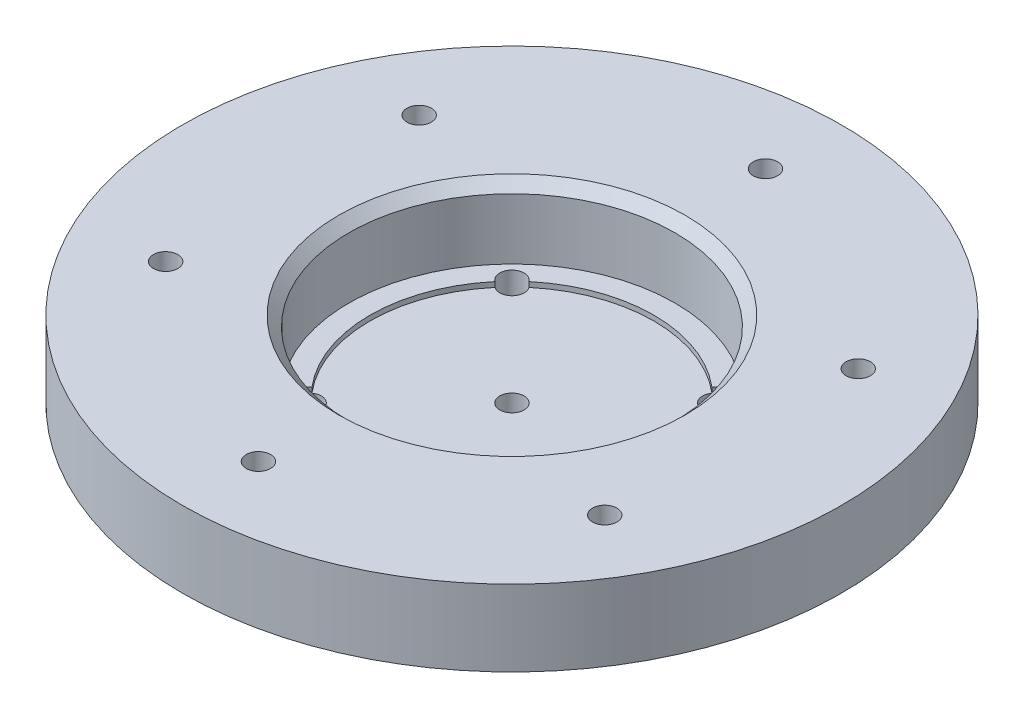
ISO-10303-21;
HEADER;
FILE_DESCRIPTION(('STEP AP214'),'2;1');
FILE_NAME('part.step','',(''),(''),'','','');
FILE_SCHEMA(('AUTOMOTIVE_DESIGN { 1 0 10303 214 1 1 1 1 }'));
ENDSEC;
DATA;
#1=APPLICATION_CONTEXT('core data for automotive mechanical design processes');
#2=APPLICATION_PROTOCOL_DEFINITION('international standard','automotive_design',2000,#1);
#3=PRODUCT_CONTEXT('',#1,'mechanical');
#4=PRODUCT('Part','Part','',(#3));
#5=PRODUCT_RELATED_PRODUCT_CATEGORY('part','',(#4));
#6=PRODUCT_DEFINITION_FORMATION('','',#4);
#7=PRODUCT_DEFINITION_CONTEXT('part definition',#1,'design');
#8=PRODUCT_DEFINITION('design','',#6,#7);
#9=PRODUCT_DEFINITION_SHAPE('','',#8);
#10=(LENGTH_UNIT() NAMED_UNIT(*) SI_UNIT(.MILLI.,.METRE.));
#11=(NAMED_UNIT(*) PLANE_ANGLE_UNIT() SI_UNIT($,.RADIAN.));
#12=(NAMED_UNIT(*) SI_UNIT($,.STERADIAN.) SOLID_ANGLE_UNIT());
#13=UNCERTAINTY_MEASURE_WITH_UNIT(LENGTH_MEASURE(1.E-05),#10,'distance_accuracy_value','');
#14=(GEOMETRIC_REPRESENTATION_CONTEXT(3) GLOBAL_UNCERTAINTY_ASSIGNED_CONTEXT((#13)) GLOBAL_UNIT_ASSIGNED_CONTEXT((#10,
#11,#12)) REPRESENTATION_CONTEXT('',''));
#15=CARTESIAN_POINT('',(0.,0.,0.));
#16=DIRECTION('',(0.,0.,1.));
#17=DIRECTION('',(1.,0.,0.));
#18=AXIS2_PLACEMENT_3D('',#15,#16,#17);
#19=CARTESIAN_POINT('',(0.,0.,0.));
#20=DIRECTION('',(0.,1.,0.));
#21=DIRECTION('',(0.,0.,1.));
#22=AXIS2_PLACEMENT_3D('',#19,#20,#21);
#23=CYLINDRICAL_SURFACE('',#22,14.);
#24=CARTESIAN_POINT('',(0.,7.5,0.));
#25=DIRECTION('',(0.,1.,0.));
#26=DIRECTION('',(0.,0.,1.));
#27=AXIS2_PLACEMENT_3D('',#24,#25,#26);
#28=CIRCLE('',#27,14.);
#29=CARTESIAN_POINT('',(-10.7015583561758,7.5,-9.02644164382415));
#30=VERTEX_POINT('',#29);
#31=CARTESIAN_POINT('',(-10.7015583561759,7.5,9.02644164382415));
#32=VERTEX_POINT('',#31);
#33=EDGE_CURVE('E123',#30,#32,#28,.T.);
#34=ORIENTED_EDGE('',*,*,#33,.F.);
#35=DIRECTION('',(0.,-1.,0.));
#36=VECTOR('',#35,1.);
#37=CARTESIAN_POINT('',(-10.7015583561758,7.5,-9.02644164382415));
#38=LINE('',#37,#36);
#39=CARTESIAN_POINT('',(-10.7015583561758,8.,-9.02644164382416));
#40=VERTEX_POINT('',#39);
#41=EDGE_CURVE('E109',#30,#40,#38,.F.);
#42=ORIENTED_EDGE('',*,*,#41,.T.);
#43=CARTESIAN_POINT('',(0.,8.,0.));
#44=DIRECTION('',(0.,1.,0.));
#45=DIRECTION('',(0.,0.,1.));
#46=AXIS2_PLACEMENT_3D('',#43,#44,#45);
#47=CIRCLE('',#46,14.);
#48=CARTESIAN_POINT('',(-10.7015583561759,8.,9.02644164382415));
#49=VERTEX_POINT('',#48);
#50=EDGE_CURVE('E121',#40,#49,#47,.T.);
#51=ORIENTED_EDGE('',*,*,#50,.T.);
#52=DIRECTION('',(0.,-1.,0.));
#53=VECTOR('',#52,1.);
#54=CARTESIAN_POINT('',(-10.7015583561758,7.5,9.02644164382415));
#55=LINE('',#54,#53);
#56=EDGE_CURVE('E157',#49,#32,#55,.T.);
#57=ORIENTED_EDGE('',*,*,#56,.T.);
#58=EDGE_LOOP('',(#34,#42,#51,#57));
#59=FACE_BOUND('',#58,.T.);
#60=ADVANCED_FACE('F43',(#59),#23,.F.);
#61=CARTESIAN_POINT('',(10.7015583561758,7.5,9.02644164382416));
#62=VERTEX_POINT('',#61);
#63=CARTESIAN_POINT('',(10.7015583561758,7.5,-9.02644164382415));
#64=VERTEX_POINT('',#63);
#65=EDGE_CURVE('E137',#62,#64,#28,.T.);
#66=ORIENTED_EDGE('',*,*,#65,.F.);
#67=DIRECTION('',(0.,-1.,0.));
#68=VECTOR('',#67,1.);
#69=CARTESIAN_POINT('',(10.7015583561758,7.5,9.02644164382415));
#70=LINE('',#69,#68);
#71=CARTESIAN_POINT('',(10.7015583561758,8.,9.02644164382416));
#72=VERTEX_POINT('',#71);
#73=EDGE_CURVE('E116',#62,#72,#70,.F.);
#74=ORIENTED_EDGE('',*,*,#73,.T.);
#75=CARTESIAN_POINT('',(10.7015583561758,8.,-9.02644164382415));
#76=VERTEX_POINT('',#75);
#77=EDGE_CURVE('E134',#72,#76,#47,.T.);
#78=ORIENTED_EDGE('',*,*,#77,.T.);
#79=DIRECTION('',(0.,-1.,0.));
#80=VECTOR('',#79,1.);
#81=CARTESIAN_POINT('',(10.7015583561758,7.5,-9.02644164382415));
#82=LINE('',#81,#80);
#83=EDGE_CURVE('E170',#76,#64,#82,.T.);
#84=ORIENTED_EDGE('',*,*,#83,.T.);
#85=EDGE_LOOP('',(#66,#74,#78,#84));
#86=FACE_BOUND('',#85,.T.);
#87=ADVANCED_FACE('F206',(#86),#23,.F.);
#88=CARTESIAN_POINT('',(9.02644164382416,8.,-10.7015583561758));
#89=VERTEX_POINT('',#88);
#90=CARTESIAN_POINT('',(-9.02644164382416,8.,-10.7015583561758));
#91=VERTEX_POINT('',#90);
#92=EDGE_CURVE('E131',#89,#91,#47,.T.);
#93=ORIENTED_EDGE('',*,*,#92,.T.);
#94=DIRECTION('',(0.,-1.,0.));
#95=VECTOR('',#94,1.);
#96=CARTESIAN_POINT('',(-9.02644164382415,7.5,-10.7015583561758));
#97=LINE('',#96,#95);
#98=CARTESIAN_POINT('',(-9.02644164382415,7.5,-10.7015583561758));
#99=VERTEX_POINT('',#98);
#100=EDGE_CURVE('E59',#91,#99,#97,.T.);
#101=ORIENTED_EDGE('',*,*,#100,.T.);
#102=CARTESIAN_POINT('',(9.02644164382416,7.5,-10.7015583561758));
#103=VERTEX_POINT('',#102);
#104=EDGE_CURVE('E139',#103,#99,#28,.T.);
#105=ORIENTED_EDGE('',*,*,#104,.F.);
#106=DIRECTION('',(0.,-1.,0.));
#107=VECTOR('',#106,1.);
#108=CARTESIAN_POINT('',(9.02644164382415,7.5,-10.7015583561758));
#109=LINE('',#108,#107);
#110=EDGE_CURVE('E173',#103,#89,#109,.F.);
#111=ORIENTED_EDGE('',*,*,#110,.T.);
#112=EDGE_LOOP('',(#93,#101,#105,#111));
#113=FACE_BOUND('',#112,.T.);
#114=ADVANCED_FACE('F213',(#113),#23,.F.);
#115=CARTESIAN_POINT('',(32.5,15.,0.));
#116=DIRECTION('',(0.,-1.,0.));
#117=DIRECTION('',(0.,0.,-1.));
#118=AXIS2_PLACEMENT_3D('',#115,#116,#117);
#119=PLANE('',#118);
#120=CARTESIAN_POINT('',(0.,15.,0.));
#121=DIRECTION('',(0.,-1.,0.));
#122=DIRECTION('',(0.,0.,-1.));
#123=AXIS2_PLACEMENT_3D('',#120,#121,#122);
#124=CIRCLE('',#123,17.075);
#125=CARTESIAN_POINT('',(0.,15.,-17.075));
#126=VERTEX_POINT('',#125);
#127=EDGE_CURVE('E187',#126,#126,#124,.T.);
#128=ORIENTED_EDGE('',*,*,#127,.T.);
#129=EDGE_LOOP('',(#128));
#130=FACE_BOUND('',#129,.T.);
#131=CARTESIAN_POINT('',(21.6506350946108,15.,-12.5000000000003));
#132=DIRECTION('',(0.,1.,0.));
#133=DIRECTION('',(0.,0.,1.));
#134=AXIS2_PLACEMENT_3D('',#131,#132,#133);
#135=CIRCLE('',#134,1.2);
#136=CARTESIAN_POINT('',(21.6506350946108,15.,-11.3000000000003));
#137=VERTEX_POINT('',#136);
#138=EDGE_CURVE('E166',#137,#137,#135,.T.);
#139=ORIENTED_EDGE('',*,*,#138,.F.);
#140=EDGE_LOOP('',(#139));
#141=FACE_BOUND('',#140,.T.);
#142=CARTESIAN_POINT('',(21.6506350946111,15.,12.4999999999998));
#143=DIRECTION('',(0.,1.,0.));
#144=DIRECTION('',(0.,0.,1.));
#145=AXIS2_PLACEMENT_3D('',#142,#143,#144);
#146=CIRCLE('',#145,1.2);
#147=CARTESIAN_POINT('',(21.6506350946111,15.,13.6999999999998));
#148=VERTEX_POINT('',#147);
#149=EDGE_CURVE('E162',#148,#148,#146,.T.);
#150=ORIENTED_EDGE('',*,*,#149,.F.);
#151=EDGE_LOOP('',(#150));
#152=FACE_BOUND('',#151,.T.);
#153=CARTESIAN_POINT('',(-21.6506350946109,15.,12.5000000000001));
#154=DIRECTION('',(0.,1.,0.));
#155=DIRECTION('',(0.,0.,1.));
#156=AXIS2_PLACEMENT_3D('',#153,#154,#155);
#157=CIRCLE('',#156,1.2);
#158=CARTESIAN_POINT('',(-21.6506350946109,15.,13.7000000000001));
#159=VERTEX_POINT('',#158);
#160=EDGE_CURVE('E269',#159,#159,#157,.T.);
#161=ORIENTED_EDGE('',*,*,#160,.F.);
#162=EDGE_LOOP('',(#161));
#163=FACE_BOUND('',#162,.T.);
#164=CARTESIAN_POINT('',(-21.650635094611,15.,-12.4999999999999));
#165=DIRECTION('',(0.,1.,0.));
#166=DIRECTION('',(0.,0.,1.));
#167=AXIS2_PLACEMENT_3D('',#164,#165,#166);
#168=CIRCLE('',#167,1.2);
#169=CARTESIAN_POINT('',(-21.650635094611,15.,-11.2999999999999));
#170=VERTEX_POINT('',#169);
#171=EDGE_CURVE('E275',#170,#170,#168,.T.);
#172=ORIENTED_EDGE('',*,*,#171,.F.);
#173=EDGE_LOOP('',(#172));
#174=FACE_BOUND('',#173,.T.);
#175=CARTESIAN_POINT('',(0.,15.,-25.));
#176=DIRECTION('',(0.,1.,0.));
#177=DIRECTION('',(0.,0.,1.));
#178=AXIS2_PLACEMENT_3D('',#175,#176,#177);
#179=CIRCLE('',#178,1.2);
#180=CARTESIAN_POINT('',(0.,15.,-23.8));
#181=VERTEX_POINT('',#180);
#182=EDGE_CURVE('E281',#181,#181,#179,.T.);
#183=ORIENTED_EDGE('',*,*,#182,.F.);
#184=EDGE_LOOP('',(#183));
#185=FACE_BOUND('',#184,.T.);
#186=CARTESIAN_POINT('',(0.,15.,0.));
#187=DIRECTION('',(0.,1.,0.));
#188=DIRECTION('',(0.,0.,1.));
#189=AXIS2_PLACEMENT_3D('',#186,#187,#188);
#190=CIRCLE('',#189,32.5);
#191=CARTESIAN_POINT('',(0.,15.,32.5));
#192=VERTEX_POINT('',#191);
#193=EDGE_CURVE('E146',#192,#192,#190,.T.);
#194=ORIENTED_EDGE('',*,*,#193,.T.);
#195=EDGE_LOOP('',(#194));
#196=FACE_BOUND('',#195,.T.);
#197=CARTESIAN_POINT('',(0.,15.,25.));
#198=DIRECTION('',(0.,1.,0.));
#199=DIRECTION('',(0.,0.,1.));
#200=AXIS2_PLACEMENT_3D('',#197,#198,#199);
#201=CIRCLE('',#200,1.2);
#202=CARTESIAN_POINT('',(0.,15.,26.2));
#203=VERTEX_POINT('',#202);
#204=EDGE_CURVE('E161',#203,#203,#201,.T.);
#205=ORIENTED_EDGE('',*,*,#204,.F.);
#206=EDGE_LOOP('',(#205));
#207=FACE_BOUND('',#206,.T.);
#208=ADVANCED_FACE('F227',(#130,#141,#152,#163,#174,#185,#196,#207),#119,.F.);
#209=CARTESIAN_POINT('',(0.,0.,0.));
#210=DIRECTION('',(0.,1.,0.));
#211=DIRECTION('',(0.,0.,1.));
#212=AXIS2_PLACEMENT_3D('',#209,#210,#211);
#213=PLANE('',#212);
#214=CARTESIAN_POINT('',(0.,0.,0.));
#215=DIRECTION('',(0.,1.,0.));
#216=DIRECTION('',(0.,0.,1.));
#217=AXIS2_PLACEMENT_3D('',#214,#215,#216);
#218=CIRCLE('',#217,19.0000000000019);
#219=CARTESIAN_POINT('',(0.,0.,19.0000000000019));
#220=VERTEX_POINT('',#219);
#221=EDGE_CURVE('E11',#220,#220,#218,.F.);
#222=ORIENTED_EDGE('',*,*,#221,.T.);
#223=EDGE_LOOP('',(#222));
#224=FACE_BOUND('',#223,.T.);
#225=CARTESIAN_POINT('',(0.,0.,0.));
#226=DIRECTION('',(0.,-1.,0.));
#227=DIRECTION('',(0.,0.,-1.));
#228=AXIS2_PLACEMENT_3D('',#225,#226,#227);
#229=CIRCLE('',#228,1.19999999999999);
#230=CARTESIAN_POINT('',(0.,0.,-1.19999999999999));
#231=VERTEX_POINT('',#230);
#232=EDGE_CURVE('E184',#231,#231,#229,.T.);
#233=ORIENTED_EDGE('',*,*,#232,.F.);
#234=EDGE_LOOP('',(#233));
#235=FACE_BOUND('',#234,.T.);
#236=CARTESIAN_POINT('',(-10.,0.,-10.));
#237=DIRECTION('',(0.,-1.,0.));
#238=DIRECTION('',(0.,0.,-1.));
#239=AXIS2_PLACEMENT_3D('',#236,#237,#238);
#240=CIRCLE('',#239,1.19999999999999);
#241=CARTESIAN_POINT('',(-10.,0.,-11.2));
#242=VERTEX_POINT('',#241);
#243=EDGE_CURVE('E183',#242,#242,#240,.T.);
#244=ORIENTED_EDGE('',*,*,#243,.F.);
#245=EDGE_LOOP('',(#244));
#246=FACE_BOUND('',#245,.T.);
#247=CARTESIAN_POINT('',(10.,0.,10.));
#248=DIRECTION('',(0.,-1.,0.));
#249=DIRECTION('',(0.,0.,-1.));
#250=AXIS2_PLACEMENT_3D('',#247,#248,#249);
#251=CIRCLE('',#250,1.19999999999999);
#252=CARTESIAN_POINT('',(10.,0.,8.80000000000001));
#253=VERTEX_POINT('',#252);
#254=EDGE_CURVE('E294',#253,#253,#251,.T.);
#255=ORIENTED_EDGE('',*,*,#254,.F.);
#256=EDGE_LOOP('',(#255));
#257=FACE_BOUND('',#256,.T.);
#258=CARTESIAN_POINT('',(10.,0.,-10.));
#259=DIRECTION('',(0.,-1.,0.));
#260=DIRECTION('',(0.,0.,-1.));
#261=AXIS2_PLACEMENT_3D('',#258,#259,#260);
#262=CIRCLE('',#261,1.19999999999999);
#263=CARTESIAN_POINT('',(10.,0.,-11.2));
#264=VERTEX_POINT('',#263);
#265=EDGE_CURVE('E244',#264,#264,#262,.T.);
#266=ORIENTED_EDGE('',*,*,#265,.F.);
#267=EDGE_LOOP('',(#266));
#268=FACE_BOUND('',#267,.T.);
#269=CARTESIAN_POINT('',(-10.,0.,10.));
#270=DIRECTION('',(0.,-1.,0.));
#271=DIRECTION('',(0.,0.,-1.));
#272=AXIS2_PLACEMENT_3D('',#269,#270,#271);
#273=CIRCLE('',#272,1.19999999999999);
#274=CARTESIAN_POINT('',(-10.,0.,8.80000000000001));
#275=VERTEX_POINT('',#274);
#276=EDGE_CURVE('E247',#275,#275,#273,.T.);
#277=ORIENTED_EDGE('',*,*,#276,.F.);
#278=EDGE_LOOP('',(#277));
#279=FACE_BOUND('',#278,.T.);
#280=ADVANCED_FACE('F232',(#224,#235,#246,#257,#268,#279),#213,.F.);
#281=CARTESIAN_POINT('',(0.,0.,0.));
#282=DIRECTION('',(0.,1.,0.));
#283=DIRECTION('',(0.,0.,1.));
#284=AXIS2_PLACEMENT_3D('',#281,#282,#283);
#285=CYLINDRICAL_SURFACE('',#284,20.0000000000009);
#286=CARTESIAN_POINT('',(0.,0.999999999999047,0.));
#287=DIRECTION('',(0.,1.,0.));
#288=DIRECTION('',(0.,0.,1.));
#289=AXIS2_PLACEMENT_3D('',#286,#287,#288);
#290=CIRCLE('',#289,20.0000000000009);
#291=CARTESIAN_POINT('',(0.,0.999999999999047,20.0000000000009));
#292=VERTEX_POINT('',#291);
#293=EDGE_CURVE('E52',#292,#292,#290,.T.);
#294=ORIENTED_EDGE('',*,*,#293,.T.);
#295=EDGE_LOOP('',(#294));
#296=FACE_BOUND('',#295,.T.);
#297=CARTESIAN_POINT('',(0.,7.5,0.));
#298=DIRECTION('',(0.,1.,0.));
#299=DIRECTION('',(0.,0.,1.));
#300=AXIS2_PLACEMENT_3D('',#297,#298,#299);
#301=CIRCLE('',#300,20.);
#302=CARTESIAN_POINT('',(0.,7.5,20.));
#303=VERTEX_POINT('',#302);
#304=EDGE_CURVE('E154',#303,#303,#301,.T.);
#305=ORIENTED_EDGE('',*,*,#304,.F.);
#306=EDGE_LOOP('',(#305));
#307=FACE_BOUND('',#306,.T.);
#308=ADVANCED_FACE('F192',(#296,#307),#285,.T.);
#309=CARTESIAN_POINT('',(20.,7.5,0.));
#310=DIRECTION('',(0.,1.,0.));
#311=DIRECTION('',(0.,0.,1.));
#312=AXIS2_PLACEMENT_3D('',#309,#310,#311);
#313=PLANE('',#312);
#314=CARTESIAN_POINT('',(21.6506350946108,7.5,-12.5000000000003));
#315=DIRECTION('',(0.,1.,0.));
#316=DIRECTION('',(0.,0.,1.));
#317=AXIS2_PLACEMENT_3D('',#314,#315,#316);
#318=CIRCLE('',#317,1.2);
#319=CARTESIAN_POINT('',(21.6506350946108,7.5,-11.3000000000003));
#320=VERTEX_POINT('',#319);
#321=EDGE_CURVE('E163',#320,#320,#318,.T.);
#322=ORIENTED_EDGE('',*,*,#321,.T.);
#323=EDGE_LOOP('',(#322));
#324=FACE_BOUND('',#323,.T.);
#325=CARTESIAN_POINT('',(21.6506350946111,7.5,12.4999999999998));
#326=DIRECTION('',(0.,1.,0.));
#327=DIRECTION('',(0.,0.,1.));
#328=AXIS2_PLACEMENT_3D('',#325,#326,#327);
#329=CIRCLE('',#328,1.2);
#330=CARTESIAN_POINT('',(21.6506350946111,7.5,13.6999999999998));
#331=VERTEX_POINT('',#330);
#332=EDGE_CURVE('E158',#331,#331,#329,.T.);
#333=ORIENTED_EDGE('',*,*,#332,.T.);
#334=EDGE_LOOP('',(#333));
#335=FACE_BOUND('',#334,.T.);
#336=CARTESIAN_POINT('',(0.,7.5,25.));
#337=DIRECTION('',(0.,1.,0.));
#338=DIRECTION('',(0.,0.,1.));
#339=AXIS2_PLACEMENT_3D('',#336,#337,#338);
#340=CIRCLE('',#339,1.2);
#341=CARTESIAN_POINT('',(0.,7.5,26.2));
#342=VERTEX_POINT('',#341);
#343=EDGE_CURVE('E266',#342,#342,#340,.T.);
#344=ORIENTED_EDGE('',*,*,#343,.T.);
#345=EDGE_LOOP('',(#344));
#346=FACE_BOUND('',#345,.T.);
#347=CARTESIAN_POINT('',(-21.6506350946109,7.5,12.5000000000001));
#348=DIRECTION('',(0.,1.,0.));
#349=DIRECTION('',(0.,0.,1.));
#350=AXIS2_PLACEMENT_3D('',#347,#348,#349);
#351=CIRCLE('',#350,1.2);
#352=CARTESIAN_POINT('',(-21.6506350946109,7.5,13.7000000000001));
#353=VERTEX_POINT('',#352);
#354=EDGE_CURVE('E272',#353,#353,#351,.T.);
#355=ORIENTED_EDGE('',*,*,#354,.T.);
#356=EDGE_LOOP('',(#355));
#357=FACE_BOUND('',#356,.T.);
#358=CARTESIAN_POINT('',(-21.650635094611,7.5,-12.4999999999999));
#359=DIRECTION('',(0.,1.,0.));
#360=DIRECTION('',(0.,0.,1.));
#361=AXIS2_PLACEMENT_3D('',#358,#359,#360);
#362=CIRCLE('',#361,1.2);
#363=CARTESIAN_POINT('',(-21.650635094611,7.5,-11.2999999999999));
#364=VERTEX_POINT('',#363);
#365=EDGE_CURVE('E278',#364,#364,#362,.T.);
#366=ORIENTED_EDGE('',*,*,#365,.T.);
#367=EDGE_LOOP('',(#366));
#368=FACE_BOUND('',#367,.T.);
#369=CARTESIAN_POINT('',(0.,7.5,-25.));
#370=DIRECTION('',(0.,1.,0.));
#371=DIRECTION('',(0.,0.,1.));
#372=AXIS2_PLACEMENT_3D('',#369,#370,#371);
#373=CIRCLE('',#372,1.2);
#374=CARTESIAN_POINT('',(0.,7.5,-23.8));
#375=VERTEX_POINT('',#374);
#376=EDGE_CURVE('E284',#375,#375,#373,.T.);
#377=ORIENTED_EDGE('',*,*,#376,.T.);
#378=EDGE_LOOP('',(#377));
#379=FACE_BOUND('',#378,.T.);
#380=CARTESIAN_POINT('',(0.,7.5,0.));
#381=DIRECTION('',(0.,1.,0.));
#382=DIRECTION('',(0.,0.,1.));
#383=AXIS2_PLACEMENT_3D('',#380,#381,#382);
#384=CIRCLE('',#383,32.5);
#385=CARTESIAN_POINT('',(0.,7.5,32.5));
#386=VERTEX_POINT('',#385);
#387=EDGE_CURVE('E149',#386,#386,#384,.T.);
#388=ORIENTED_EDGE('',*,*,#387,.F.);
#389=EDGE_LOOP('',(#388));
#390=FACE_BOUND('',#389,.T.);
#391=ORIENTED_EDGE('',*,*,#304,.T.);
#392=EDGE_LOOP('',(#391));
#393=FACE_BOUND('',#392,.T.);
#394=ADVANCED_FACE('F367',(#324,#335,#346,#357,#368,#379,#390,#393),#313,.F.);
#395=CARTESIAN_POINT('',(0.,0.,0.));
#396=DIRECTION('',(0.,1.,0.));
#397=DIRECTION('',(0.,0.,1.));
#398=AXIS2_PLACEMENT_3D('',#395,#396,#397);
#399=CYLINDRICAL_SURFACE('',#398,32.5);
#400=ORIENTED_EDGE('',*,*,#193,.F.);
#401=EDGE_LOOP('',(#400));
#402=FACE_BOUND('',#401,.T.);
#403=ORIENTED_EDGE('',*,*,#387,.T.);
#404=EDGE_LOOP('',(#403));
#405=FACE_BOUND('',#404,.T.);
#406=ADVANCED_FACE('F369',(#402,#405),#399,.T.);
#407=CARTESIAN_POINT('',(0.,0.,0.));
#408=DIRECTION('',(0.,1.,0.));
#409=DIRECTION('',(0.,0.,1.));
#410=AXIS2_PLACEMENT_3D('',#407,#408,#409);
#411=CYLINDRICAL_SURFACE('',#410,16.075);
#412=CARTESIAN_POINT('',(0.,14.,0.));
#413=DIRECTION('',(0.,-1.,0.));
#414=DIRECTION('',(0.,0.,-1.));
#415=AXIS2_PLACEMENT_3D('',#412,#413,#414);
#416=CIRCLE('',#415,16.075);
#417=CARTESIAN_POINT('',(0.,14.,-16.075));
#418=VERTEX_POINT('',#417);
#419=EDGE_CURVE('E115',#418,#418,#416,.F.);
#420=ORIENTED_EDGE('',*,*,#419,.T.);
#421=EDGE_LOOP('',(#420));
#422=FACE_BOUND('',#421,.T.);
#423=CARTESIAN_POINT('',(0.,8.,0.));
#424=DIRECTION('',(0.,1.,0.));
#425=DIRECTION('',(0.,0.,1.));
#426=AXIS2_PLACEMENT_3D('',#423,#424,#425);
#427=CIRCLE('',#426,16.075);
#428=CARTESIAN_POINT('',(0.,8.,16.075));
#429=VERTEX_POINT('',#428);
#430=EDGE_CURVE('E142',#429,#429,#427,.T.);
#431=ORIENTED_EDGE('',*,*,#430,.F.);
#432=EDGE_LOOP('',(#431));
#433=FACE_BOUND('',#432,.T.);
#434=ADVANCED_FACE('F225',(#422,#433),#411,.F.);
#435=CARTESIAN_POINT('',(14.,8.,0.));
#436=DIRECTION('',(0.,-1.,0.));
#437=DIRECTION('',(0.,0.,-1.));
#438=AXIS2_PLACEMENT_3D('',#435,#436,#437);
#439=PLANE('',#438);
#440=ORIENTED_EDGE('',*,*,#50,.F.);
#441=CARTESIAN_POINT('',(-10.,8.,-10.));
#442=DIRECTION('',(0.,-1.,0.));
#443=DIRECTION('',(0.,0.,-1.));
#444=AXIS2_PLACEMENT_3D('',#441,#442,#443);
#445=CIRCLE('',#444,1.19999999999999);
#446=EDGE_CURVE('E106',#40,#91,#445,.T.);
#447=ORIENTED_EDGE('',*,*,#446,.T.);
#448=ORIENTED_EDGE('',*,*,#92,.F.);
#449=CARTESIAN_POINT('',(10.,8.,-10.));
#450=DIRECTION('',(0.,-1.,0.));
#451=DIRECTION('',(0.,0.,-1.));
#452=AXIS2_PLACEMENT_3D('',#449,#450,#451);
#453=CIRCLE('',#452,1.19999999999999);
#454=EDGE_CURVE('E239',#89,#76,#453,.T.);
#455=ORIENTED_EDGE('',*,*,#454,.T.);
#456=ORIENTED_EDGE('',*,*,#77,.F.);
#457=CARTESIAN_POINT('',(10.,8.,10.));
#458=DIRECTION('',(0.,-1.,0.));
#459=DIRECTION('',(0.,0.,-1.));
#460=AXIS2_PLACEMENT_3D('',#457,#458,#459);
#461=CIRCLE('',#460,1.19999999999999);
#462=CARTESIAN_POINT('',(9.02644164382415,8.,10.7015583561758));
#463=VERTEX_POINT('',#462);
#464=EDGE_CURVE('E250',#72,#463,#461,.T.);
#465=ORIENTED_EDGE('',*,*,#464,.T.);
#466=CARTESIAN_POINT('',(-9.02644164382416,8.,10.7015583561758));
#467=VERTEX_POINT('',#466);
#468=EDGE_CURVE('E135',#467,#463,#47,.T.);
#469=ORIENTED_EDGE('',*,*,#468,.F.);
#470=CARTESIAN_POINT('',(-10.,8.,10.));
#471=DIRECTION('',(0.,-1.,0.));
#472=DIRECTION('',(0.,0.,-1.));
#473=AXIS2_PLACEMENT_3D('',#470,#471,#472);
#474=CIRCLE('',#473,1.19999999999999);
#475=EDGE_CURVE('E130',#467,#49,#474,.T.);
#476=ORIENTED_EDGE('',*,*,#475,.T.);
#477=EDGE_LOOP('',(#440,#447,#448,#455,#456,#465,#469,#476));
#478=FACE_BOUND('',#477,.T.);
#479=ORIENTED_EDGE('',*,*,#430,.T.);
#480=EDGE_LOOP('',(#479));
#481=FACE_BOUND('',#480,.T.);
#482=ADVANCED_FACE('F127',(#478,#481),#439,.F.);
#483=ORIENTED_EDGE('',*,*,#468,.T.);
#484=DIRECTION('',(0.,-1.,0.));
#485=VECTOR('',#484,1.);
#486=CARTESIAN_POINT('',(9.02644164382415,7.5,10.7015583561758));
#487=LINE('',#486,#485);
#488=CARTESIAN_POINT('',(9.02644164382415,7.5,10.7015583561758));
#489=VERTEX_POINT('',#488);
#490=EDGE_CURVE('E176',#463,#489,#487,.T.);
#491=ORIENTED_EDGE('',*,*,#490,.T.);
#492=CARTESIAN_POINT('',(-9.02644164382416,7.5,10.7015583561758));
#493=VERTEX_POINT('',#492);
#494=EDGE_CURVE('E132',#493,#489,#28,.T.);
#495=ORIENTED_EDGE('',*,*,#494,.F.);
#496=DIRECTION('',(0.,-1.,0.));
#497=VECTOR('',#496,1.);
#498=CARTESIAN_POINT('',(-9.02644164382415,7.5,10.7015583561758));
#499=LINE('',#498,#497);
#500=EDGE_CURVE('E168',#493,#467,#499,.F.);
#501=ORIENTED_EDGE('',*,*,#500,.T.);
#502=EDGE_LOOP('',(#483,#491,#495,#501));
#503=FACE_BOUND('',#502,.T.);
#504=ADVANCED_FACE('F208',(#503),#23,.F.);
#505=CARTESIAN_POINT('',(14.,7.5,0.));
#506=DIRECTION('',(0.,-1.,0.));
#507=DIRECTION('',(0.,0.,-1.));
#508=AXIS2_PLACEMENT_3D('',#505,#506,#507);
#509=PLANE('',#508);
#510=CARTESIAN_POINT('',(0.,7.5,0.));
#511=DIRECTION('',(0.,-1.,0.));
#512=DIRECTION('',(0.,0.,-1.));
#513=AXIS2_PLACEMENT_3D('',#510,#511,#512);
#514=CIRCLE('',#513,1.19999999999999);
#515=CARTESIAN_POINT('',(0.,7.5,-1.19999999999999));
#516=VERTEX_POINT('',#515);
#517=EDGE_CURVE('E180',#516,#516,#514,.T.);
#518=ORIENTED_EDGE('',*,*,#517,.T.);
#519=EDGE_LOOP('',(#518));
#520=FACE_BOUND('',#519,.T.);
#521=ORIENTED_EDGE('',*,*,#104,.T.);
#522=CARTESIAN_POINT('',(-10.,7.5,-10.));
#523=DIRECTION('',(0.,-1.,0.));
#524=DIRECTION('',(0.,0.,-1.));
#525=AXIS2_PLACEMENT_3D('',#522,#523,#524);
#526=CIRCLE('',#525,1.19999999999999);
#527=EDGE_CURVE('E124',#99,#30,#526,.T.);
#528=ORIENTED_EDGE('',*,*,#527,.T.);
#529=ORIENTED_EDGE('',*,*,#33,.T.);
#530=CARTESIAN_POINT('',(-10.,7.5,10.));
#531=DIRECTION('',(0.,-1.,0.));
#532=DIRECTION('',(0.,0.,-1.));
#533=AXIS2_PLACEMENT_3D('',#530,#531,#532);
#534=CIRCLE('',#533,1.19999999999999);
#535=EDGE_CURVE('E256',#32,#493,#534,.T.);
#536=ORIENTED_EDGE('',*,*,#535,.T.);
#537=ORIENTED_EDGE('',*,*,#494,.T.);
#538=CARTESIAN_POINT('',(10.,7.5,10.));
#539=DIRECTION('',(0.,-1.,0.));
#540=DIRECTION('',(0.,0.,-1.));
#541=AXIS2_PLACEMENT_3D('',#538,#539,#540);
#542=CIRCLE('',#541,1.19999999999999);
#543=EDGE_CURVE('E67',#489,#62,#542,.T.);
#544=ORIENTED_EDGE('',*,*,#543,.T.);
#545=ORIENTED_EDGE('',*,*,#65,.T.);
#546=CARTESIAN_POINT('',(10.,7.5,-10.));
#547=DIRECTION('',(0.,-1.,0.));
#548=DIRECTION('',(0.,0.,-1.));
#549=AXIS2_PLACEMENT_3D('',#546,#547,#548);
#550=CIRCLE('',#549,1.19999999999999);
#551=EDGE_CURVE('E243',#64,#103,#550,.T.);
#552=ORIENTED_EDGE('',*,*,#551,.T.);
#553=EDGE_LOOP('',(#521,#528,#529,#536,#537,#544,#545,#552));
#554=FACE_BOUND('',#553,.T.);
#555=ADVANCED_FACE('F218',(#520,#554),#509,.F.);
#556=CARTESIAN_POINT('',(0.,15.,-25.));
#557=DIRECTION('',(0.,1.,0.));
#558=DIRECTION('',(0.,0.,1.));
#559=AXIS2_PLACEMENT_3D('',#556,#557,#558);
#560=CYLINDRICAL_SURFACE('',#559,1.2);
#561=ORIENTED_EDGE('',*,*,#182,.T.);
#562=EDGE_LOOP('',(#561));
#563=FACE_BOUND('',#562,.T.);
#564=ORIENTED_EDGE('',*,*,#376,.F.);
#565=EDGE_LOOP('',(#564));
#566=FACE_BOUND('',#565,.T.);
#567=ADVANCED_FACE('F223',(#563,#566),#560,.F.);
#568=CARTESIAN_POINT('',(-21.650635094611,15.,-12.4999999999999));
#569=DIRECTION('',(0.,1.,0.));
#570=DIRECTION('',(0.,0.,1.));
#571=AXIS2_PLACEMENT_3D('',#568,#569,#570);
#572=CYLINDRICAL_SURFACE('',#571,1.2);
#573=ORIENTED_EDGE('',*,*,#171,.T.);
#574=EDGE_LOOP('',(#573));
#575=FACE_BOUND('',#574,.T.);
#576=ORIENTED_EDGE('',*,*,#365,.F.);
#577=EDGE_LOOP('',(#576));
#578=FACE_BOUND('',#577,.T.);
#579=ADVANCED_FACE('F346',(#575,#578),#572,.F.);
#580=CARTESIAN_POINT('',(-21.6506350946109,15.,12.5000000000001));
#581=DIRECTION('',(0.,1.,0.));
#582=DIRECTION('',(0.,0.,1.));
#583=AXIS2_PLACEMENT_3D('',#580,#581,#582);
#584=CYLINDRICAL_SURFACE('',#583,1.2);
#585=ORIENTED_EDGE('',*,*,#160,.T.);
#586=EDGE_LOOP('',(#585));
#587=FACE_BOUND('',#586,.T.);
#588=ORIENTED_EDGE('',*,*,#354,.F.);
#589=EDGE_LOOP('',(#588));
#590=FACE_BOUND('',#589,.T.);
#591=ADVANCED_FACE('F342',(#587,#590),#584,.F.);
#592=CARTESIAN_POINT('',(0.,15.,25.));
#593=DIRECTION('',(0.,1.,0.));
#594=DIRECTION('',(0.,0.,1.));
#595=AXIS2_PLACEMENT_3D('',#592,#593,#594);
#596=CYLINDRICAL_SURFACE('',#595,1.2);
#597=ORIENTED_EDGE('',*,*,#204,.T.);
#598=EDGE_LOOP('',(#597));
#599=FACE_BOUND('',#598,.T.);
#600=ORIENTED_EDGE('',*,*,#343,.F.);
#601=EDGE_LOOP('',(#600));
#602=FACE_BOUND('',#601,.T.);
#603=ADVANCED_FACE('F338',(#599,#602),#596,.F.);
#604=CARTESIAN_POINT('',(21.6506350946111,15.,12.4999999999998));
#605=DIRECTION('',(0.,1.,0.));
#606=DIRECTION('',(0.,0.,1.));
#607=AXIS2_PLACEMENT_3D('',#604,#605,#606);
#608=CYLINDRICAL_SURFACE('',#607,1.2);
#609=ORIENTED_EDGE('',*,*,#149,.T.);
#610=EDGE_LOOP('',(#609));
#611=FACE_BOUND('',#610,.T.);
#612=ORIENTED_EDGE('',*,*,#332,.F.);
#613=EDGE_LOOP('',(#612));
#614=FACE_BOUND('',#613,.T.);
#615=ADVANCED_FACE('F331',(#611,#614),#608,.F.);
#616=CARTESIAN_POINT('',(21.6506350946108,15.,-12.5000000000003));
#617=DIRECTION('',(0.,1.,0.));
#618=DIRECTION('',(0.,0.,1.));
#619=AXIS2_PLACEMENT_3D('',#616,#617,#618);
#620=CYLINDRICAL_SURFACE('',#619,1.2);
#621=ORIENTED_EDGE('',*,*,#138,.T.);
#622=EDGE_LOOP('',(#621));
#623=FACE_BOUND('',#622,.T.);
#624=ORIENTED_EDGE('',*,*,#321,.F.);
#625=EDGE_LOOP('',(#624));
#626=FACE_BOUND('',#625,.T.);
#627=ADVANCED_FACE('F323',(#623,#626),#620,.F.);
#628=CARTESIAN_POINT('',(-10.,0.,10.));
#629=DIRECTION('',(0.,-1.,0.));
#630=DIRECTION('',(0.,0.,-1.));
#631=AXIS2_PLACEMENT_3D('',#628,#629,#630);
#632=CYLINDRICAL_SURFACE('',#631,1.19999999999999);
#633=ORIENTED_EDGE('',*,*,#276,.T.);
#634=EDGE_LOOP('',(#633));
#635=FACE_BOUND('',#634,.T.);
#636=ORIENTED_EDGE('',*,*,#535,.F.);
#637=ORIENTED_EDGE('',*,*,#56,.F.);
#638=ORIENTED_EDGE('',*,*,#475,.F.);
#639=ORIENTED_EDGE('',*,*,#500,.F.);
#640=EDGE_LOOP('',(#636,#637,#638,#639));
#641=FACE_BOUND('',#640,.T.);
#642=ADVANCED_FACE('F320',(#635,#641),#632,.F.);
#643=CARTESIAN_POINT('',(10.,0.,-10.));
#644=DIRECTION('',(0.,-1.,0.));
#645=DIRECTION('',(0.,0.,-1.));
#646=AXIS2_PLACEMENT_3D('',#643,#644,#645);
#647=CYLINDRICAL_SURFACE('',#646,1.19999999999999);
#648=ORIENTED_EDGE('',*,*,#265,.T.);
#649=EDGE_LOOP('',(#648));
#650=FACE_BOUND('',#649,.T.);
#651=ORIENTED_EDGE('',*,*,#551,.F.);
#652=ORIENTED_EDGE('',*,*,#83,.F.);
#653=ORIENTED_EDGE('',*,*,#454,.F.);
#654=ORIENTED_EDGE('',*,*,#110,.F.);
#655=EDGE_LOOP('',(#651,#652,#653,#654));
#656=FACE_BOUND('',#655,.T.);
#657=ADVANCED_FACE('F292',(#650,#656),#647,.F.);
#658=CARTESIAN_POINT('',(10.,0.,10.));
#659=DIRECTION('',(0.,-1.,0.));
#660=DIRECTION('',(0.,0.,-1.));
#661=AXIS2_PLACEMENT_3D('',#658,#659,#660);
#662=CYLINDRICAL_SURFACE('',#661,1.19999999999999);
#663=ORIENTED_EDGE('',*,*,#254,.T.);
#664=EDGE_LOOP('',(#663));
#665=FACE_BOUND('',#664,.T.);
#666=ORIENTED_EDGE('',*,*,#543,.F.);
#667=ORIENTED_EDGE('',*,*,#490,.F.);
#668=ORIENTED_EDGE('',*,*,#464,.F.);
#669=ORIENTED_EDGE('',*,*,#73,.F.);
#670=EDGE_LOOP('',(#666,#667,#668,#669));
#671=FACE_BOUND('',#670,.T.);
#672=ADVANCED_FACE('F293',(#665,#671),#662,.F.);
#673=CARTESIAN_POINT('',(-10.,0.,-10.));
#674=DIRECTION('',(0.,-1.,0.));
#675=DIRECTION('',(0.,0.,-1.));
#676=AXIS2_PLACEMENT_3D('',#673,#674,#675);
#677=CYLINDRICAL_SURFACE('',#676,1.19999999999999);
#678=ORIENTED_EDGE('',*,*,#243,.T.);
#679=EDGE_LOOP('',(#678));
#680=FACE_BOUND('',#679,.T.);
#681=ORIENTED_EDGE('',*,*,#100,.F.);
#682=ORIENTED_EDGE('',*,*,#446,.F.);
#683=ORIENTED_EDGE('',*,*,#41,.F.);
#684=ORIENTED_EDGE('',*,*,#527,.F.);
#685=EDGE_LOOP('',(#681,#682,#683,#684));
#686=FACE_BOUND('',#685,.T.);
#687=ADVANCED_FACE('F108',(#680,#686),#677,.F.);
#688=CARTESIAN_POINT('',(0.,0.,0.));
#689=DIRECTION('',(0.,-1.,0.));
#690=DIRECTION('',(0.,0.,-1.));
#691=AXIS2_PLACEMENT_3D('',#688,#689,#690);
#692=CYLINDRICAL_SURFACE('',#691,1.19999999999999);
#693=ORIENTED_EDGE('',*,*,#232,.T.);
#694=EDGE_LOOP('',(#693));
#695=FACE_BOUND('',#694,.T.);
#696=ORIENTED_EDGE('',*,*,#517,.F.);
#697=EDGE_LOOP('',(#696));
#698=FACE_BOUND('',#697,.T.);
#699=ADVANCED_FACE('F202',(#695,#698),#692,.F.);
#700=CARTESIAN_POINT('',(0.,14.,0.));
#701=DIRECTION('',(0.,1.,0.));
#702=DIRECTION('',(0.,0.,1.));
#703=AXIS2_PLACEMENT_3D('',#700,#701,#702);
#704=CONICAL_SURFACE('',#703,16.075,0.785398163397448);
#705=ORIENTED_EDGE('',*,*,#127,.F.);
#706=EDGE_LOOP('',(#705));
#707=FACE_BOUND('',#706,.T.);
#708=ORIENTED_EDGE('',*,*,#419,.F.);
#709=EDGE_LOOP('',(#708));
#710=FACE_BOUND('',#709,.T.);
#711=ADVANCED_FACE('F196',(#707,#710),#704,.F.);
#712=CARTESIAN_POINT('',(0.,0.999999999999047,0.));
#713=DIRECTION('',(0.,1.,0.));
#714=DIRECTION('',(0.,0.,1.));
#715=AXIS2_PLACEMENT_3D('',#712,#713,#714);
#716=CONICAL_SURFACE('',#715,20.0000000000009,0.785398163397455);
#717=ORIENTED_EDGE('',*,*,#221,.F.);
#718=EDGE_LOOP('',(#717));
#719=FACE_BOUND('',#718,.T.);
#720=ORIENTED_EDGE('',*,*,#293,.F.);
#721=EDGE_LOOP('',(#720));
#722=FACE_BOUND('',#721,.T.);
#723=ADVANCED_FACE('F46',(#719,#722),#716,.T.);
#724=CLOSED_SHELL('',(#60,#87,#114,#208,#280,#308,#394,#406,#434,#482,#504,#555,#567,#579,#591,
#603,#615,#627,#642,#657,#672,#687,#699,#711,#723));
#725=MANIFOLD_SOLID_BREP('B2',#724);
#726=ADVANCED_BREP_SHAPE_REPRESENTATION('',(#18,#725),#14);
#727=SHAPE_DEFINITION_REPRESENTATION(#9,#726);
ENDSEC;
END-ISO-10303-21;
